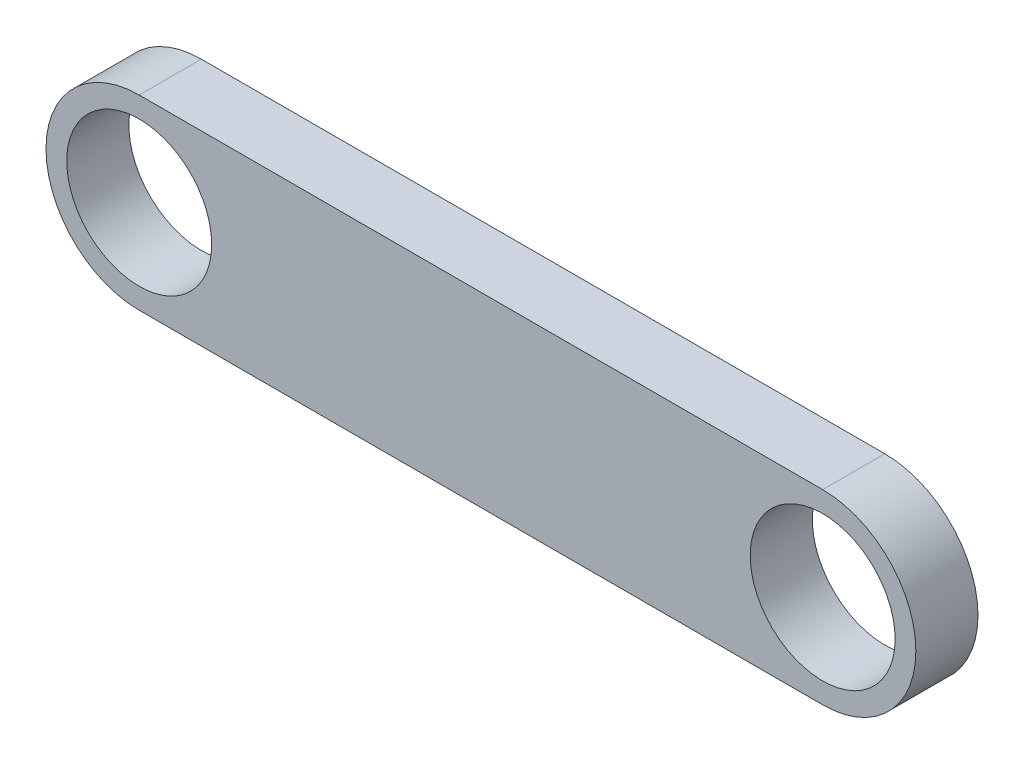
ISO-10303-21;
HEADER;
FILE_DESCRIPTION(('STEP AP214'),'2;1');
FILE_NAME('part.step','',(''),(''),'','','');
FILE_SCHEMA(('AUTOMOTIVE_DESIGN { 1 0 10303 214 1 1 1 1 }'));
ENDSEC;
DATA;
#1=APPLICATION_CONTEXT('core data for automotive mechanical design processes');
#2=APPLICATION_PROTOCOL_DEFINITION('international standard','automotive_design',2000,#1);
#3=PRODUCT_CONTEXT('',#1,'mechanical');
#4=PRODUCT('Part','Part','',(#3));
#5=PRODUCT_RELATED_PRODUCT_CATEGORY('part','',(#4));
#6=PRODUCT_DEFINITION_FORMATION('','',#4);
#7=PRODUCT_DEFINITION_CONTEXT('part definition',#1,'design');
#8=PRODUCT_DEFINITION('design','',#6,#7);
#9=PRODUCT_DEFINITION_SHAPE('','',#8);
#10=(LENGTH_UNIT() NAMED_UNIT(*) SI_UNIT(.MILLI.,.METRE.));
#11=(NAMED_UNIT(*) PLANE_ANGLE_UNIT() SI_UNIT($,.RADIAN.));
#12=(NAMED_UNIT(*) SI_UNIT($,.STERADIAN.) SOLID_ANGLE_UNIT());
#13=UNCERTAINTY_MEASURE_WITH_UNIT(LENGTH_MEASURE(1.E-05),#10,'distance_accuracy_value','');
#14=(GEOMETRIC_REPRESENTATION_CONTEXT(3) GLOBAL_UNCERTAINTY_ASSIGNED_CONTEXT((#13)) GLOBAL_UNIT_ASSIGNED_CONTEXT((#10,
#11,#12)) REPRESENTATION_CONTEXT('',''));
#15=CARTESIAN_POINT('',(0.,0.,0.));
#16=DIRECTION('',(0.,0.,1.));
#17=DIRECTION('',(1.,0.,0.));
#18=AXIS2_PLACEMENT_3D('',#15,#16,#17);
#19=CARTESIAN_POINT('',(0.,0.,1.5));
#20=DIRECTION('',(0.,0.,-1.));
#21=DIRECTION('',(-1.,0.,0.));
#22=AXIS2_PLACEMENT_3D('',#19,#20,#21);
#23=CYLINDRICAL_SURFACE('',#22,4.5);
#24=CARTESIAN_POINT('',(0.,0.,-1.5));
#25=DIRECTION('',(0.,0.,1.));
#26=DIRECTION('',(1.,0.,0.));
#27=AXIS2_PLACEMENT_3D('',#24,#25,#26);
#28=CIRCLE('',#27,4.5);
#29=CARTESIAN_POINT('',(0.,4.5,-1.5));
#30=VERTEX_POINT('',#29);
#31=CARTESIAN_POINT('',(0.,-4.5,-1.5));
#32=VERTEX_POINT('',#31);
#33=EDGE_CURVE('E125',#30,#32,#28,.T.);
#34=ORIENTED_EDGE('',*,*,#33,.T.);
#35=DIRECTION('',(0.,0.,-1.));
#36=VECTOR('',#35,1.);
#37=CARTESIAN_POINT('',(0.,-4.5,1.5));
#38=LINE('',#37,#36);
#39=CARTESIAN_POINT('',(0.,-4.5,1.5));
#40=VERTEX_POINT('',#39);
#41=EDGE_CURVE('E11',#40,#32,#38,.T.);
#42=ORIENTED_EDGE('',*,*,#41,.F.);
#43=CARTESIAN_POINT('',(0.,0.,1.5));
#44=DIRECTION('',(0.,0.,1.));
#45=DIRECTION('',(1.,0.,0.));
#46=AXIS2_PLACEMENT_3D('',#43,#44,#45);
#47=CIRCLE('',#46,4.5);
#48=CARTESIAN_POINT('',(0.,4.5,1.5));
#49=VERTEX_POINT('',#48);
#50=EDGE_CURVE('E99',#49,#40,#47,.T.);
#51=ORIENTED_EDGE('',*,*,#50,.F.);
#52=DIRECTION('',(0.,0.,-1.));
#53=VECTOR('',#52,1.);
#54=CARTESIAN_POINT('',(0.,4.5,1.5));
#55=LINE('',#54,#53);
#56=EDGE_CURVE('E65',#49,#30,#55,.T.);
#57=ORIENTED_EDGE('',*,*,#56,.T.);
#58=EDGE_LOOP('',(#34,#42,#51,#57));
#59=FACE_BOUND('',#58,.T.);
#60=ADVANCED_FACE('F47',(#59),#23,.T.);
#61=CARTESIAN_POINT('',(0.,-4.5,1.5));
#62=DIRECTION('',(0.,1.,0.));
#63=DIRECTION('',(-1.,0.,0.));
#64=AXIS2_PLACEMENT_3D('',#61,#62,#63);
#65=PLANE('',#64);
#66=DIRECTION('',(1.,0.,0.));
#67=VECTOR('',#66,1.);
#68=CARTESIAN_POINT('',(0.,-4.5,-1.5));
#69=LINE('',#68,#67);
#70=CARTESIAN_POINT('',(33.,-4.5,-1.5));
#71=VERTEX_POINT('',#70);
#72=EDGE_CURVE('E105',#32,#71,#69,.T.);
#73=ORIENTED_EDGE('',*,*,#72,.T.);
#74=DIRECTION('',(0.,0.,-1.));
#75=VECTOR('',#74,1.);
#76=CARTESIAN_POINT('',(33.,-4.5,1.5));
#77=LINE('',#76,#75);
#78=CARTESIAN_POINT('',(33.,-4.5,1.5));
#79=VERTEX_POINT('',#78);
#80=EDGE_CURVE('E57',#79,#71,#77,.T.);
#81=ORIENTED_EDGE('',*,*,#80,.F.);
#82=DIRECTION('',(1.,0.,0.));
#83=VECTOR('',#82,1.);
#84=CARTESIAN_POINT('',(0.,-4.5,1.5));
#85=LINE('',#84,#83);
#86=EDGE_CURVE('E91',#40,#79,#85,.T.);
#87=ORIENTED_EDGE('',*,*,#86,.F.);
#88=ORIENTED_EDGE('',*,*,#41,.T.);
#89=EDGE_LOOP('',(#73,#81,#87,#88));
#90=FACE_BOUND('',#89,.T.);
#91=ADVANCED_FACE('F104',(#90),#65,.F.);
#92=CARTESIAN_POINT('',(33.,0.,1.5));
#93=DIRECTION('',(0.,0.,-1.));
#94=DIRECTION('',(-1.,0.,0.));
#95=AXIS2_PLACEMENT_3D('',#92,#93,#94);
#96=CYLINDRICAL_SURFACE('',#95,4.5);
#97=CARTESIAN_POINT('',(33.,0.,-1.5));
#98=DIRECTION('',(0.,0.,1.));
#99=DIRECTION('',(1.,0.,0.));
#100=AXIS2_PLACEMENT_3D('',#97,#98,#99);
#101=CIRCLE('',#100,4.5);
#102=CARTESIAN_POINT('',(33.,4.5,-1.5));
#103=VERTEX_POINT('',#102);
#104=EDGE_CURVE('E130',#71,#103,#101,.T.);
#105=ORIENTED_EDGE('',*,*,#104,.T.);
#106=DIRECTION('',(0.,0.,-1.));
#107=VECTOR('',#106,1.);
#108=CARTESIAN_POINT('',(33.,4.5,1.5));
#109=LINE('',#108,#107);
#110=CARTESIAN_POINT('',(33.,4.5,1.5));
#111=VERTEX_POINT('',#110);
#112=EDGE_CURVE('E80',#111,#103,#109,.T.);
#113=ORIENTED_EDGE('',*,*,#112,.F.);
#114=CARTESIAN_POINT('',(33.,0.,1.5));
#115=DIRECTION('',(0.,0.,1.));
#116=DIRECTION('',(1.,0.,0.));
#117=AXIS2_PLACEMENT_3D('',#114,#115,#116);
#118=CIRCLE('',#117,4.5);
#119=EDGE_CURVE('E98',#79,#111,#118,.T.);
#120=ORIENTED_EDGE('',*,*,#119,.F.);
#121=ORIENTED_EDGE('',*,*,#80,.T.);
#122=EDGE_LOOP('',(#105,#113,#120,#121));
#123=FACE_BOUND('',#122,.T.);
#124=ADVANCED_FACE('F109',(#123),#96,.T.);
#125=CARTESIAN_POINT('',(0.,4.5,1.5));
#126=DIRECTION('',(0.,1.,0.));
#127=DIRECTION('',(0.,0.,1.));
#128=AXIS2_PLACEMENT_3D('',#125,#126,#127);
#129=PLANE('',#128);
#130=DIRECTION('',(1.,0.,0.));
#131=VECTOR('',#130,1.);
#132=CARTESIAN_POINT('',(0.,4.5,-1.5));
#133=LINE('',#132,#131);
#134=EDGE_CURVE('E133',#30,#103,#133,.T.);
#135=ORIENTED_EDGE('',*,*,#134,.F.);
#136=ORIENTED_EDGE('',*,*,#56,.F.);
#137=DIRECTION('',(1.,0.,0.));
#138=VECTOR('',#137,1.);
#139=CARTESIAN_POINT('',(0.,4.5,1.5));
#140=LINE('',#139,#138);
#141=EDGE_CURVE('E111',#49,#111,#140,.T.);
#142=ORIENTED_EDGE('',*,*,#141,.T.);
#143=ORIENTED_EDGE('',*,*,#112,.T.);
#144=EDGE_LOOP('',(#135,#136,#142,#143));
#145=FACE_BOUND('',#144,.T.);
#146=ADVANCED_FACE('F175',(#145),#129,.T.);
#147=CARTESIAN_POINT('',(0.,0.,1.5));
#148=DIRECTION('',(0.,0.,-1.));
#149=DIRECTION('',(-1.,0.,0.));
#150=AXIS2_PLACEMENT_3D('',#147,#148,#149);
#151=CYLINDRICAL_SURFACE('',#150,3.5);
#152=CARTESIAN_POINT('',(0.,0.,1.5));
#153=DIRECTION('',(0.,0.,1.));
#154=DIRECTION('',(1.,0.,0.));
#155=AXIS2_PLACEMENT_3D('',#152,#153,#154);
#156=CIRCLE('',#155,3.5);
#157=CARTESIAN_POINT('',(3.5,0.,1.5));
#158=VERTEX_POINT('',#157);
#159=EDGE_CURVE('E141',#158,#158,#156,.T.);
#160=ORIENTED_EDGE('',*,*,#159,.T.);
#161=EDGE_LOOP('',(#160));
#162=FACE_BOUND('',#161,.T.);
#163=CARTESIAN_POINT('',(0.,0.,-1.5));
#164=DIRECTION('',(0.,0.,1.));
#165=DIRECTION('',(1.,0.,0.));
#166=AXIS2_PLACEMENT_3D('',#163,#164,#165);
#167=CIRCLE('',#166,3.5);
#168=CARTESIAN_POINT('',(3.5,0.,-1.5));
#169=VERTEX_POINT('',#168);
#170=EDGE_CURVE('E121',#169,#169,#167,.T.);
#171=ORIENTED_EDGE('',*,*,#170,.F.);
#172=EDGE_LOOP('',(#171));
#173=FACE_BOUND('',#172,.T.);
#174=ADVANCED_FACE('F49',(#162,#173),#151,.F.);
#175=CARTESIAN_POINT('',(33.,0.,1.5));
#176=DIRECTION('',(0.,0.,-1.));
#177=DIRECTION('',(-1.,0.,0.));
#178=AXIS2_PLACEMENT_3D('',#175,#176,#177);
#179=CYLINDRICAL_SURFACE('',#178,3.49999999999999);
#180=CARTESIAN_POINT('',(33.,0.,1.5));
#181=DIRECTION('',(0.,0.,1.));
#182=DIRECTION('',(1.,0.,0.));
#183=AXIS2_PLACEMENT_3D('',#180,#181,#182);
#184=CIRCLE('',#183,3.49999999999999);
#185=CARTESIAN_POINT('',(36.5,0.,1.5));
#186=VERTEX_POINT('',#185);
#187=EDGE_CURVE('E114',#186,#186,#184,.T.);
#188=ORIENTED_EDGE('',*,*,#187,.T.);
#189=EDGE_LOOP('',(#188));
#190=FACE_BOUND('',#189,.T.);
#191=CARTESIAN_POINT('',(33.,0.,-1.5));
#192=DIRECTION('',(0.,0.,1.));
#193=DIRECTION('',(1.,0.,0.));
#194=AXIS2_PLACEMENT_3D('',#191,#192,#193);
#195=CIRCLE('',#194,3.49999999999999);
#196=CARTESIAN_POINT('',(36.5,0.,-1.5));
#197=VERTEX_POINT('',#196);
#198=EDGE_CURVE('E137',#197,#197,#195,.T.);
#199=ORIENTED_EDGE('',*,*,#198,.F.);
#200=EDGE_LOOP('',(#199));
#201=FACE_BOUND('',#200,.T.);
#202=ADVANCED_FACE('F157',(#190,#201),#179,.F.);
#203=CARTESIAN_POINT('',(0.,0.,1.5));
#204=DIRECTION('',(0.,0.,1.));
#205=DIRECTION('',(1.,0.,0.));
#206=AXIS2_PLACEMENT_3D('',#203,#204,#205);
#207=PLANE('',#206);
#208=ORIENTED_EDGE('',*,*,#159,.F.);
#209=EDGE_LOOP('',(#208));
#210=FACE_BOUND('',#209,.T.);
#211=ORIENTED_EDGE('',*,*,#50,.T.);
#212=ORIENTED_EDGE('',*,*,#86,.T.);
#213=ORIENTED_EDGE('',*,*,#119,.T.);
#214=ORIENTED_EDGE('',*,*,#141,.F.);
#215=EDGE_LOOP('',(#211,#212,#213,#214));
#216=FACE_BOUND('',#215,.T.);
#217=ORIENTED_EDGE('',*,*,#187,.F.);
#218=EDGE_LOOP('',(#217));
#219=FACE_BOUND('',#218,.T.);
#220=ADVANCED_FACE('F94',(#210,#216,#219),#207,.T.);
#221=CARTESIAN_POINT('',(0.,0.,-1.5));
#222=DIRECTION('',(0.,0.,1.));
#223=DIRECTION('',(1.,0.,0.));
#224=AXIS2_PLACEMENT_3D('',#221,#222,#223);
#225=PLANE('',#224);
#226=ORIENTED_EDGE('',*,*,#170,.T.);
#227=EDGE_LOOP('',(#226));
#228=FACE_BOUND('',#227,.T.);
#229=ORIENTED_EDGE('',*,*,#33,.F.);
#230=ORIENTED_EDGE('',*,*,#134,.T.);
#231=ORIENTED_EDGE('',*,*,#104,.F.);
#232=ORIENTED_EDGE('',*,*,#72,.F.);
#233=EDGE_LOOP('',(#229,#230,#231,#232));
#234=FACE_BOUND('',#233,.T.);
#235=ORIENTED_EDGE('',*,*,#198,.T.);
#236=EDGE_LOOP('',(#235));
#237=FACE_BOUND('',#236,.T.);
#238=ADVANCED_FACE('F156',(#228,#234,#237),#225,.F.);
#239=CLOSED_SHELL('',(#60,#91,#124,#146,#174,#202,#220,#238));
#240=MANIFOLD_SOLID_BREP('B2',#239);
#241=ADVANCED_BREP_SHAPE_REPRESENTATION('',(#18,#240),#14);
#242=SHAPE_DEFINITION_REPRESENTATION(#9,#241);
ENDSEC;
END-ISO-10303-21;
